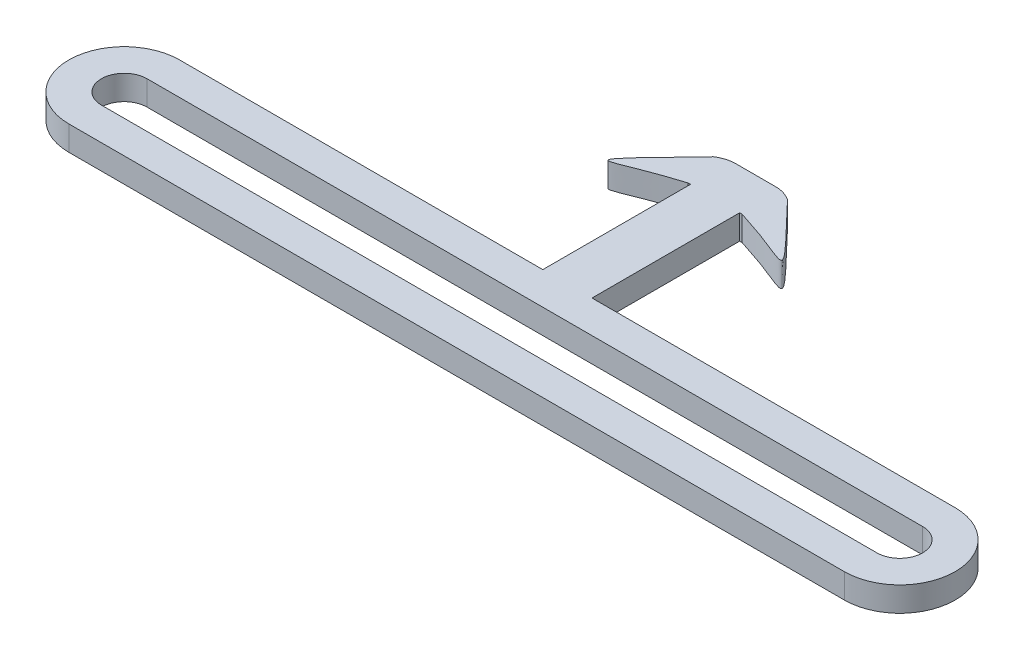
ISO-10303-21;
HEADER;
FILE_DESCRIPTION(('STEP AP214'),'2;1');
FILE_NAME('part.step','',(''),(''),'','','');
FILE_SCHEMA(('AUTOMOTIVE_DESIGN { 1 0 10303 214 1 1 1 1 }'));
ENDSEC;
DATA;
#1=APPLICATION_CONTEXT('core data for automotive mechanical design processes');
#2=APPLICATION_PROTOCOL_DEFINITION('international standard','automotive_design',2000,#1);
#3=PRODUCT_CONTEXT('',#1,'mechanical');
#4=PRODUCT('Part','Part','',(#3));
#5=PRODUCT_RELATED_PRODUCT_CATEGORY('part','',(#4));
#6=PRODUCT_DEFINITION_FORMATION('','',#4);
#7=PRODUCT_DEFINITION_CONTEXT('part definition',#1,'design');
#8=PRODUCT_DEFINITION('design','',#6,#7);
#9=PRODUCT_DEFINITION_SHAPE('','',#8);
#10=(LENGTH_UNIT() NAMED_UNIT(*) SI_UNIT(.MILLI.,.METRE.));
#11=(NAMED_UNIT(*) PLANE_ANGLE_UNIT() SI_UNIT($,.RADIAN.));
#12=(NAMED_UNIT(*) SI_UNIT($,.STERADIAN.) SOLID_ANGLE_UNIT());
#13=UNCERTAINTY_MEASURE_WITH_UNIT(LENGTH_MEASURE(1.E-05),#10,'distance_accuracy_value','');
#14=(GEOMETRIC_REPRESENTATION_CONTEXT(3) GLOBAL_UNCERTAINTY_ASSIGNED_CONTEXT((#13)) GLOBAL_UNIT_ASSIGNED_CONTEXT((#10,
#11,#12)) REPRESENTATION_CONTEXT('',''));
#15=CARTESIAN_POINT('',(0.,0.,0.));
#16=DIRECTION('',(0.,0.,1.));
#17=DIRECTION('',(1.,0.,0.));
#18=AXIS2_PLACEMENT_3D('',#15,#16,#17);
#19=CARTESIAN_POINT('',(-40.0341902731434,1.27,-0.0149194848737301));
#20=DIRECTION('',(0.,1.,0.));
#21=DIRECTION('',(0.,0.,1.));
#22=AXIS2_PLACEMENT_3D('',#19,#20,#21);
#23=PLANE('',#22);
#24=CARTESIAN_POINT('',(-40.0341902731434,1.27,-0.0149194848737301));
#25=DIRECTION('',(0.,1.,0.));
#26=DIRECTION('',(0.,0.,1.));
#27=AXIS2_PLACEMENT_3D('',#24,#25,#26);
#28=CIRCLE('',#27,5.71847295364556);
#29=CARTESIAN_POINT('',(-40.0341745110672,1.27,-5.73339243849756));
#30=VERTEX_POINT('',#29);
#31=CARTESIAN_POINT('',(-40.0341745110672,1.27,5.7035534687501));
#32=VERTEX_POINT('',#31);
#33=EDGE_CURVE('E205',#30,#32,#28,.T.);
#34=ORIENTED_EDGE('',*,*,#33,.T.);
#35=DIRECTION('',(1.,0.,0.));
#36=VECTOR('',#35,1.);
#37=CARTESIAN_POINT('',(-40.0341745110672,1.27,5.7035534687501));
#38=LINE('',#37,#36);
#39=CARTESIAN_POINT('',(40.0236836922629,1.27,5.7035534687501));
#40=VERTEX_POINT('',#39);
#41=EDGE_CURVE('E202',#32,#40,#38,.T.);
#42=ORIENTED_EDGE('',*,*,#41,.T.);
#43=CARTESIAN_POINT('',(40.023699454339,1.27,-0.0149194848737301));
#44=DIRECTION('',(0.,1.,0.));
#45=DIRECTION('',(0.,0.,1.));
#46=AXIS2_PLACEMENT_3D('',#43,#44,#45);
#47=CIRCLE('',#46,5.71847295364556);
#48=CARTESIAN_POINT('',(40.0236836922629,1.27,-5.73339243849756));
#49=VERTEX_POINT('',#48);
#50=EDGE_CURVE('E208',#40,#49,#47,.T.);
#51=ORIENTED_EDGE('',*,*,#50,.T.);
#52=DIRECTION('',(-1.,0.,0.));
#53=VECTOR('',#52,1.);
#54=CARTESIAN_POINT('',(2.53475459059783,1.27,-5.73339243849756));
#55=LINE('',#54,#53);
#56=CARTESIAN_POINT('',(2.53475459059783,1.27,-5.73339243849756));
#57=VERTEX_POINT('',#56);
#58=EDGE_CURVE('E209',#49,#57,#55,.T.);
#59=ORIENTED_EDGE('',*,*,#58,.T.);
#60=DIRECTION('',(0.,0.,-1.));
#61=VECTOR('',#60,1.);
#62=CARTESIAN_POINT('',(2.53475459059783,1.27,-5.73339243849756));
#63=LINE('',#62,#61);
#64=CARTESIAN_POINT('',(2.53475459059783,1.27,-20.9796872274859));
#65=VERTEX_POINT('',#64);
#66=EDGE_CURVE('E215',#57,#65,#63,.T.);
#67=ORIENTED_EDGE('',*,*,#66,.T.);
#68=DIRECTION('',(1.,0.,0.));
#69=VECTOR('',#68,1.);
#70=CARTESIAN_POINT('',(2.53475459059783,1.27,-20.9796872274859));
#71=LINE('',#70,#69);
#72=CARTESIAN_POINT('',(2.78162607733212,1.27,-20.9796872274859));
#73=VERTEX_POINT('',#72);
#74=EDGE_CURVE('E212',#65,#73,#71,.T.);
#75=ORIENTED_EDGE('',*,*,#74,.T.);
#76=CARTESIAN_POINT('',(2.78162607733212,1.27,-20.9796872274859));
#77=CARTESIAN_POINT('',(3.52042885987217,1.27,-20.7454387312885));
#78=CARTESIAN_POINT('',(9.64139567893254,1.27,-18.7539301977186));
#79=CARTESIAN_POINT('',(11.0773756931817,1.27,-17.0362187075331));
#80=CARTESIAN_POINT('',(3.81513243898493,1.27,-24.6322950873317));
#81=B_SPLINE_CURVE_WITH_KNOTS('',3,(#76,#77,#78,#79,#80),.UNSPECIFIED.,.F.,.F.,(4,1,4),(0.,
0.0920840873115873,0.688115303605151),.UNSPECIFIED.);
#82=CARTESIAN_POINT('',(3.81513243898493,1.27,-24.6322950873317));
#83=VERTEX_POINT('',#82);
#84=EDGE_CURVE('E216',#73,#83,#81,.T.);
#85=ORIENTED_EDGE('',*,*,#84,.T.);
#86=CARTESIAN_POINT('',(2.04302221044935,1.27,-21.9448379265403));
#87=DIRECTION('',(0.,1.,0.));
#88=DIRECTION('',(0.,0.,-1.));
#89=AXIS2_PLACEMENT_3D('',#86,#87,#88);
#90=CIRCLE('',#89,3.21913041878852);
#91=CARTESIAN_POINT('',(2.04302221044935,1.27,-25.1639683453288));
#92=VERTEX_POINT('',#91);
#93=EDGE_CURVE('E222',#83,#92,#90,.T.);
#94=ORIENTED_EDGE('',*,*,#93,.T.);
#95=DIRECTION('',(-1.,0.,0.));
#96=VECTOR('',#95,1.);
#97=CARTESIAN_POINT('',(-2.05351302925369,1.27,-25.1639683453288));
#98=LINE('',#97,#96);
#99=CARTESIAN_POINT('',(-2.05351302925369,1.27,-25.1639683453288));
#100=VERTEX_POINT('',#99);
#101=EDGE_CURVE('E414',#92,#100,#98,.T.);
#102=ORIENTED_EDGE('',*,*,#101,.T.);
#103=CARTESIAN_POINT('',(-2.05351302925369,1.27,-21.9448379265403));
#104=DIRECTION('',(0.,1.,0.));
#105=DIRECTION('',(0.,0.,1.));
#106=AXIS2_PLACEMENT_3D('',#103,#104,#105);
#107=CIRCLE('',#106,3.21913041878852);
#108=CARTESIAN_POINT('',(-3.82562325778927,1.27,-24.6322950873317));
#109=VERTEX_POINT('',#108);
#110=EDGE_CURVE('E291',#100,#109,#107,.T.);
#111=ORIENTED_EDGE('',*,*,#110,.T.);
#112=CARTESIAN_POINT('',(-3.82562325778927,1.27,-24.6322950873317));
#113=CARTESIAN_POINT('',(-11.1749253657315,1.27,-17.014448000265));
#114=CARTESIAN_POINT('',(-9.5602391181665,1.27,-18.7816400789337));
#115=CARTESIAN_POINT('',(-3.53525924793453,1.27,-20.7452071795836));
#116=CARTESIAN_POINT('',(-2.79211689613646,1.27,-20.9796872274859));
#117=B_SPLINE_CURVE_WITH_KNOTS('',3,(#112,#113,#114,#115,#116),.UNSPECIFIED.,.F.,.F.,(4,1,4),
(0.,0.594260847383624,0.687271601673899),.UNSPECIFIED.);
#118=CARTESIAN_POINT('',(-2.79211689613646,1.27,-20.9796872274859));
#119=VERTEX_POINT('',#118);
#120=EDGE_CURVE('E287',#109,#119,#117,.T.);
#121=ORIENTED_EDGE('',*,*,#120,.T.);
#122=DIRECTION('',(1.,0.,0.));
#123=VECTOR('',#122,1.);
#124=CARTESIAN_POINT('',(-2.79211689613646,1.27,-20.9796872274859));
#125=LINE('',#124,#123);
#126=CARTESIAN_POINT('',(-2.54524540940217,1.27,-20.9796872274859));
#127=VERTEX_POINT('',#126);
#128=EDGE_CURVE('E295',#119,#127,#125,.T.);
#129=ORIENTED_EDGE('',*,*,#128,.T.);
#130=DIRECTION('',(0.,0.,1.));
#131=VECTOR('',#130,1.);
#132=CARTESIAN_POINT('',(-2.54524540940217,1.27,-5.73339243849756));
#133=LINE('',#132,#131);
#134=CARTESIAN_POINT('',(-2.54524540940217,1.27,-5.73339243849756));
#135=VERTEX_POINT('',#134);
#136=EDGE_CURVE('E297',#127,#135,#133,.T.);
#137=ORIENTED_EDGE('',*,*,#136,.T.);
#138=DIRECTION('',(-1.,0.,0.));
#139=VECTOR('',#138,1.);
#140=CARTESIAN_POINT('',(-40.0341745110672,1.27,-5.73339243849756));
#141=LINE('',#140,#139);
#142=EDGE_CURVE('E296',#135,#30,#141,.T.);
#143=ORIENTED_EDGE('',*,*,#142,.T.);
#144=EDGE_LOOP('',(#34,#42,#51,#59,#67,#75,#85,#94,#102,#111,#121,#129,#137,#143));
#145=FACE_BOUND('',#144,.T.);
#146=DIRECTION('',(1.,0.,0.));
#147=VECTOR('',#146,1.);
#148=CARTESIAN_POINT('',(-40.0341902731434,1.27,2.34273040802263));
#149=LINE('',#148,#147);
#150=CARTESIAN_POINT('',(-40.0341902731434,1.27,2.34273040802263));
#151=VERTEX_POINT('',#150);
#152=CARTESIAN_POINT('',(40.023699454339,1.27,2.34273040802263));
#153=VERTEX_POINT('',#152);
#154=EDGE_CURVE('E175',#151,#153,#149,.T.);
#155=ORIENTED_EDGE('',*,*,#154,.F.);
#156=CARTESIAN_POINT('',(-40.0341902731434,1.27,-0.0149194848737301));
#157=DIRECTION('',(0.,1.,0.));
#158=DIRECTION('',(0.,0.,1.));
#159=AXIS2_PLACEMENT_3D('',#156,#157,#158);
#160=CIRCLE('',#159,2.35764989289636);
#161=CARTESIAN_POINT('',(-40.0341902731434,1.27,-2.37256937777009));
#162=VERTEX_POINT('',#161);
#163=EDGE_CURVE('E167',#162,#151,#160,.T.);
#164=ORIENTED_EDGE('',*,*,#163,.F.);
#165=DIRECTION('',(-1.,0.,0.));
#166=VECTOR('',#165,1.);
#167=CARTESIAN_POINT('',(-40.0341902731434,1.27,-2.37256937777009));
#168=LINE('',#167,#166);
#169=CARTESIAN_POINT('',(40.023699454339,1.27,-2.37256937777009));
#170=VERTEX_POINT('',#169);
#171=EDGE_CURVE('E187',#170,#162,#168,.T.);
#172=ORIENTED_EDGE('',*,*,#171,.F.);
#173=CARTESIAN_POINT('',(40.023699454339,1.27,-0.0149194848737301));
#174=DIRECTION('',(0.,1.,0.));
#175=DIRECTION('',(0.,0.,1.));
#176=AXIS2_PLACEMENT_3D('',#173,#174,#175);
#177=CIRCLE('',#176,2.35764989289636);
#178=EDGE_CURVE('E188',#153,#170,#177,.T.);
#179=ORIENTED_EDGE('',*,*,#178,.F.);
#180=EDGE_LOOP('',(#155,#164,#172,#179));
#181=FACE_BOUND('',#180,.T.);
#182=ADVANCED_FACE('F41',(#145,#181),#23,.T.);
#183=CARTESIAN_POINT('',(-40.0341902731434,-1.27,-0.0149194848737301));
#184=DIRECTION('',(0.,1.,0.));
#185=DIRECTION('',(0.,0.,1.));
#186=AXIS2_PLACEMENT_3D('',#183,#184,#185);
#187=PLANE('',#186);
#188=CARTESIAN_POINT('',(-40.0341902731434,-1.27,-0.0149194848737301));
#189=DIRECTION('',(0.,1.,0.));
#190=DIRECTION('',(0.,0.,1.));
#191=AXIS2_PLACEMENT_3D('',#188,#189,#190);
#192=CIRCLE('',#191,5.71847295364556);
#193=CARTESIAN_POINT('',(-40.0341745110672,-1.27,-5.73339243849756));
#194=VERTEX_POINT('',#193);
#195=CARTESIAN_POINT('',(-40.0341745110672,-1.27,5.7035534687501));
#196=VERTEX_POINT('',#195);
#197=EDGE_CURVE('E185',#194,#196,#192,.T.);
#198=ORIENTED_EDGE('',*,*,#197,.F.);
#199=DIRECTION('',(-1.,0.,0.));
#200=VECTOR('',#199,1.);
#201=CARTESIAN_POINT('',(-40.0341745110672,-1.27,-5.73339243849756));
#202=LINE('',#201,#200);
#203=CARTESIAN_POINT('',(-2.54524540940217,-1.27,-5.73339243849756));
#204=VERTEX_POINT('',#203);
#205=EDGE_CURVE('E206',#204,#194,#202,.T.);
#206=ORIENTED_EDGE('',*,*,#205,.F.);
#207=DIRECTION('',(0.,0.,1.));
#208=VECTOR('',#207,1.);
#209=CARTESIAN_POINT('',(-2.54524540940217,-1.27,-5.73339243849756));
#210=LINE('',#209,#208);
#211=CARTESIAN_POINT('',(-2.54524540940217,-1.27,-20.9796872274859));
#212=VERTEX_POINT('',#211);
#213=EDGE_CURVE('E339',#212,#204,#210,.T.);
#214=ORIENTED_EDGE('',*,*,#213,.F.);
#215=DIRECTION('',(1.,0.,0.));
#216=VECTOR('',#215,1.);
#217=CARTESIAN_POINT('',(-2.79211689613646,-1.27,-20.9796872274859));
#218=LINE('',#217,#216);
#219=CARTESIAN_POINT('',(-2.79211689613646,-1.27,-20.9796872274859));
#220=VERTEX_POINT('',#219);
#221=EDGE_CURVE('E335',#220,#212,#218,.T.);
#222=ORIENTED_EDGE('',*,*,#221,.F.);
#223=CARTESIAN_POINT('',(-3.82562325778927,-1.27,-24.6322950873317));
#224=CARTESIAN_POINT('',(-11.1749253657315,-1.27,-17.014448000265));
#225=CARTESIAN_POINT('',(-9.5602391181665,-1.27,-18.7816400789337));
#226=CARTESIAN_POINT('',(-3.53525924793453,-1.27,-20.7452071795836));
#227=CARTESIAN_POINT('',(-2.79211689613646,-1.27,-20.9796872274859));
#228=B_SPLINE_CURVE_WITH_KNOTS('',3,(#223,#224,#225,#226,#227),.UNSPECIFIED.,.F.,.F.,(4,1,4),
(0.,0.594260847383624,0.687271601673899),.UNSPECIFIED.);
#229=CARTESIAN_POINT('',(-3.82562325778927,-1.27,-24.6322950873317));
#230=VERTEX_POINT('',#229);
#231=EDGE_CURVE('E327',#230,#220,#228,.T.);
#232=ORIENTED_EDGE('',*,*,#231,.F.);
#233=CARTESIAN_POINT('',(-2.05351302925369,-1.27,-21.9448379265403));
#234=DIRECTION('',(0.,1.,0.));
#235=DIRECTION('',(0.,0.,1.));
#236=AXIS2_PLACEMENT_3D('',#233,#234,#235);
#237=CIRCLE('',#236,3.21913041878852);
#238=CARTESIAN_POINT('',(-2.05351302925369,-1.27,-25.1639683453288));
#239=VERTEX_POINT('',#238);
#240=EDGE_CURVE('E326',#239,#230,#237,.T.);
#241=ORIENTED_EDGE('',*,*,#240,.F.);
#242=DIRECTION('',(-1.,0.,0.));
#243=VECTOR('',#242,1.);
#244=CARTESIAN_POINT('',(-2.05351302925369,-1.27,-25.1639683453288));
#245=LINE('',#244,#243);
#246=CARTESIAN_POINT('',(2.04302221044935,-1.27,-25.1639683453288));
#247=VERTEX_POINT('',#246);
#248=EDGE_CURVE('E322',#247,#239,#245,.T.);
#249=ORIENTED_EDGE('',*,*,#248,.F.);
#250=CARTESIAN_POINT('',(2.04302221044935,-1.27,-21.9448379265403));
#251=DIRECTION('',(0.,1.,0.));
#252=DIRECTION('',(0.,0.,-1.));
#253=AXIS2_PLACEMENT_3D('',#250,#251,#252);
#254=CIRCLE('',#253,3.21913041878852);
#255=CARTESIAN_POINT('',(3.81513243898493,-1.27,-24.6322950873317));
#256=VERTEX_POINT('',#255);
#257=EDGE_CURVE('E317',#256,#247,#254,.T.);
#258=ORIENTED_EDGE('',*,*,#257,.F.);
#259=CARTESIAN_POINT('',(2.78162607733212,-1.27,-20.9796872274859));
#260=CARTESIAN_POINT('',(3.52042885987217,-1.27,-20.7454387312885));
#261=CARTESIAN_POINT('',(9.64139567893254,-1.27,-18.7539301977186));
#262=CARTESIAN_POINT('',(11.0773756931817,-1.27,-17.0362187075331));
#263=CARTESIAN_POINT('',(3.81513243898493,-1.27,-24.6322950873317));
#264=B_SPLINE_CURVE_WITH_KNOTS('',3,(#259,#260,#261,#262,#263),.UNSPECIFIED.,.F.,.F.,(4,1,4),
(0.,0.0920840873115873,0.688115303605151),.UNSPECIFIED.);
#265=CARTESIAN_POINT('',(2.78162607733212,-1.27,-20.9796872274859));
#266=VERTEX_POINT('',#265);
#267=EDGE_CURVE('E312',#266,#256,#264,.T.);
#268=ORIENTED_EDGE('',*,*,#267,.F.);
#269=DIRECTION('',(1.,0.,0.));
#270=VECTOR('',#269,1.);
#271=CARTESIAN_POINT('',(2.53475459059783,-1.27,-20.9796872274859));
#272=LINE('',#271,#270);
#273=CARTESIAN_POINT('',(2.53475459059783,-1.27,-20.9796872274859));
#274=VERTEX_POINT('',#273);
#275=EDGE_CURVE('E311',#274,#266,#272,.T.);
#276=ORIENTED_EDGE('',*,*,#275,.F.);
#277=DIRECTION('',(0.,0.,-1.));
#278=VECTOR('',#277,1.);
#279=CARTESIAN_POINT('',(2.53475459059783,-1.27,-5.73339243849756));
#280=LINE('',#279,#278);
#281=CARTESIAN_POINT('',(2.53475459059783,-1.27,-5.73339243849756));
#282=VERTEX_POINT('',#281);
#283=EDGE_CURVE('E313',#282,#274,#280,.T.);
#284=ORIENTED_EDGE('',*,*,#283,.F.);
#285=DIRECTION('',(-1.,0.,0.));
#286=VECTOR('',#285,1.);
#287=CARTESIAN_POINT('',(2.53475459059783,-1.27,-5.73339243849756));
#288=LINE('',#287,#286);
#289=CARTESIAN_POINT('',(40.0236836922629,-1.27,-5.73339243849756));
#290=VERTEX_POINT('',#289);
#291=EDGE_CURVE('E310',#290,#282,#288,.T.);
#292=ORIENTED_EDGE('',*,*,#291,.F.);
#293=CARTESIAN_POINT('',(40.023699454339,-1.27,-0.0149194848737301));
#294=DIRECTION('',(0.,1.,0.));
#295=DIRECTION('',(0.,0.,1.));
#296=AXIS2_PLACEMENT_3D('',#293,#294,#295);
#297=CIRCLE('',#296,5.71847295364556);
#298=CARTESIAN_POINT('',(40.0236836922629,-1.27,5.7035534687501));
#299=VERTEX_POINT('',#298);
#300=EDGE_CURVE('E307',#299,#290,#297,.T.);
#301=ORIENTED_EDGE('',*,*,#300,.F.);
#302=DIRECTION('',(1.,0.,0.));
#303=VECTOR('',#302,1.);
#304=CARTESIAN_POINT('',(-40.0341745110672,-1.27,5.7035534687501));
#305=LINE('',#304,#303);
#306=EDGE_CURVE('E303',#196,#299,#305,.T.);
#307=ORIENTED_EDGE('',*,*,#306,.F.);
#308=EDGE_LOOP('',(#198,#206,#214,#222,#232,#241,#249,#258,#268,#276,#284,#292,#301,#307));
#309=FACE_BOUND('',#308,.T.);
#310=CARTESIAN_POINT('',(-40.0341902731434,-1.27,-0.0149194848737301));
#311=DIRECTION('',(0.,1.,0.));
#312=DIRECTION('',(0.,0.,1.));
#313=AXIS2_PLACEMENT_3D('',#310,#311,#312);
#314=CIRCLE('',#313,2.35764989289636);
#315=CARTESIAN_POINT('',(-40.0341902731434,-1.27,-2.37256937777009));
#316=VERTEX_POINT('',#315);
#317=CARTESIAN_POINT('',(-40.0341902731434,-1.27,2.34273040802263));
#318=VERTEX_POINT('',#317);
#319=EDGE_CURVE('E65',#316,#318,#314,.T.);
#320=ORIENTED_EDGE('',*,*,#319,.T.);
#321=DIRECTION('',(1.,0.,0.));
#322=VECTOR('',#321,1.);
#323=CARTESIAN_POINT('',(-40.0341902731434,-1.27,2.34273040802263));
#324=LINE('',#323,#322);
#325=CARTESIAN_POINT('',(40.023699454339,-1.27,2.34273040802263));
#326=VERTEX_POINT('',#325);
#327=EDGE_CURVE('E182',#318,#326,#324,.T.);
#328=ORIENTED_EDGE('',*,*,#327,.T.);
#329=CARTESIAN_POINT('',(40.023699454339,-1.27,-0.0149194848737301));
#330=DIRECTION('',(0.,1.,0.));
#331=DIRECTION('',(0.,0.,1.));
#332=AXIS2_PLACEMENT_3D('',#329,#330,#331);
#333=CIRCLE('',#332,2.35764989289636);
#334=CARTESIAN_POINT('',(40.023699454339,-1.27,-2.37256937777009));
#335=VERTEX_POINT('',#334);
#336=EDGE_CURVE('E191',#326,#335,#333,.T.);
#337=ORIENTED_EDGE('',*,*,#336,.T.);
#338=DIRECTION('',(-1.,0.,0.));
#339=VECTOR('',#338,1.);
#340=CARTESIAN_POINT('',(-40.0341902731434,-1.27,-2.37256937777009));
#341=LINE('',#340,#339);
#342=EDGE_CURVE('E171',#335,#316,#341,.T.);
#343=ORIENTED_EDGE('',*,*,#342,.T.);
#344=EDGE_LOOP('',(#320,#328,#337,#343));
#345=FACE_BOUND('',#344,.T.);
#346=ADVANCED_FACE('F254',(#309,#345),#187,.F.);
#347=CARTESIAN_POINT('',(-40.0341902731434,1.27,-0.0149194848737301));
#348=DIRECTION('',(0.,-1.,0.));
#349=DIRECTION('',(0.,0.,-1.));
#350=AXIS2_PLACEMENT_3D('',#347,#348,#349);
#351=CYLINDRICAL_SURFACE('',#350,5.71847295364556);
#352=ORIENTED_EDGE('',*,*,#197,.T.);
#353=DIRECTION('',(0.,-1.,0.));
#354=VECTOR('',#353,1.);
#355=CARTESIAN_POINT('',(-40.0341745110672,1.27,5.7035534687501));
#356=LINE('',#355,#354);
#357=EDGE_CURVE('E11',#32,#196,#356,.T.);
#358=ORIENTED_EDGE('',*,*,#357,.F.);
#359=ORIENTED_EDGE('',*,*,#33,.F.);
#360=DIRECTION('',(0.,-1.,0.));
#361=VECTOR('',#360,1.);
#362=CARTESIAN_POINT('',(-40.0341745110672,1.27,-5.73339243849756));
#363=LINE('',#362,#361);
#364=EDGE_CURVE('E305',#30,#194,#363,.T.);
#365=ORIENTED_EDGE('',*,*,#364,.T.);
#366=EDGE_LOOP('',(#352,#358,#359,#365));
#367=FACE_BOUND('',#366,.T.);
#368=ADVANCED_FACE('F43',(#367),#351,.T.);
#369=CARTESIAN_POINT('',(-40.0341745110672,1.27,5.7035534687501));
#370=DIRECTION('',(0.,0.,-1.));
#371=DIRECTION('',(-1.,0.,0.));
#372=AXIS2_PLACEMENT_3D('',#369,#370,#371);
#373=PLANE('',#372);
#374=ORIENTED_EDGE('',*,*,#306,.T.);
#375=DIRECTION('',(0.,-1.,0.));
#376=VECTOR('',#375,1.);
#377=CARTESIAN_POINT('',(40.0236836922629,1.27,5.7035534687501));
#378=LINE('',#377,#376);
#379=EDGE_CURVE('E47',#40,#299,#378,.T.);
#380=ORIENTED_EDGE('',*,*,#379,.F.);
#381=ORIENTED_EDGE('',*,*,#41,.F.);
#382=ORIENTED_EDGE('',*,*,#357,.T.);
#383=EDGE_LOOP('',(#374,#380,#381,#382));
#384=FACE_BOUND('',#383,.T.);
#385=ADVANCED_FACE('F249',(#384),#373,.F.);
#386=CARTESIAN_POINT('',(40.023699454339,1.27,-0.0149194848737301));
#387=DIRECTION('',(0.,-1.,0.));
#388=DIRECTION('',(0.,0.,-1.));
#389=AXIS2_PLACEMENT_3D('',#386,#387,#388);
#390=CYLINDRICAL_SURFACE('',#389,5.71847295364556);
#391=ORIENTED_EDGE('',*,*,#300,.T.);
#392=DIRECTION('',(0.,-1.,0.));
#393=VECTOR('',#392,1.);
#394=CARTESIAN_POINT('',(40.0236836922629,1.27,-5.73339243849756));
#395=LINE('',#394,#393);
#396=EDGE_CURVE('E375',#49,#290,#395,.T.);
#397=ORIENTED_EDGE('',*,*,#396,.F.);
#398=ORIENTED_EDGE('',*,*,#50,.F.);
#399=ORIENTED_EDGE('',*,*,#379,.T.);
#400=EDGE_LOOP('',(#391,#397,#398,#399));
#401=FACE_BOUND('',#400,.T.);
#402=ADVANCED_FACE('F241',(#401),#390,.T.);
#403=CARTESIAN_POINT('',(2.53475459059783,1.27,-5.73339243849756));
#404=DIRECTION('',(0.,0.,1.));
#405=DIRECTION('',(1.,0.,0.));
#406=AXIS2_PLACEMENT_3D('',#403,#404,#405);
#407=PLANE('',#406);
#408=ORIENTED_EDGE('',*,*,#291,.T.);
#409=DIRECTION('',(0.,-1.,0.));
#410=VECTOR('',#409,1.);
#411=CARTESIAN_POINT('',(2.53475459059783,1.27,-5.73339243849756));
#412=LINE('',#411,#410);
#413=EDGE_CURVE('E369',#57,#282,#412,.T.);
#414=ORIENTED_EDGE('',*,*,#413,.F.);
#415=ORIENTED_EDGE('',*,*,#58,.F.);
#416=ORIENTED_EDGE('',*,*,#396,.T.);
#417=EDGE_LOOP('',(#408,#414,#415,#416));
#418=FACE_BOUND('',#417,.T.);
#419=ADVANCED_FACE('F243',(#418),#407,.F.);
#420=CARTESIAN_POINT('',(2.53475459059783,1.27,-5.73339243849756));
#421=DIRECTION('',(-1.,0.,0.));
#422=DIRECTION('',(0.,0.,1.));
#423=AXIS2_PLACEMENT_3D('',#420,#421,#422);
#424=PLANE('',#423);
#425=ORIENTED_EDGE('',*,*,#283,.T.);
#426=DIRECTION('',(0.,-1.,0.));
#427=VECTOR('',#426,1.);
#428=CARTESIAN_POINT('',(2.53475459059783,1.27,-20.9796872274859));
#429=LINE('',#428,#427);
#430=EDGE_CURVE('E368',#65,#274,#429,.T.);
#431=ORIENTED_EDGE('',*,*,#430,.F.);
#432=ORIENTED_EDGE('',*,*,#66,.F.);
#433=ORIENTED_EDGE('',*,*,#413,.T.);
#434=EDGE_LOOP('',(#425,#431,#432,#433));
#435=FACE_BOUND('',#434,.T.);
#436=ADVANCED_FACE('F240',(#435),#424,.F.);
#437=CARTESIAN_POINT('',(2.53475459059783,1.27,-20.9796872274859));
#438=DIRECTION('',(0.,0.,-1.));
#439=DIRECTION('',(-1.,0.,0.));
#440=AXIS2_PLACEMENT_3D('',#437,#438,#439);
#441=PLANE('',#440);
#442=ORIENTED_EDGE('',*,*,#275,.T.);
#443=DIRECTION('',(0.,-1.,0.));
#444=VECTOR('',#443,1.);
#445=CARTESIAN_POINT('',(2.78162607733212,1.27,-20.9796872274859));
#446=LINE('',#445,#444);
#447=EDGE_CURVE('E361',#73,#266,#446,.T.);
#448=ORIENTED_EDGE('',*,*,#447,.F.);
#449=ORIENTED_EDGE('',*,*,#74,.F.);
#450=ORIENTED_EDGE('',*,*,#430,.T.);
#451=EDGE_LOOP('',(#442,#448,#449,#450));
#452=FACE_BOUND('',#451,.T.);
#453=ADVANCED_FACE('F235',(#452),#441,.F.);
#454=DIRECTION('',(0.,-1.,0.));
#455=VECTOR('',#454,1.);
#456=SURFACE_OF_LINEAR_EXTRUSION('',#81,#455);
#457=ORIENTED_EDGE('',*,*,#267,.T.);
#458=DIRECTION('',(0.,-1.,0.));
#459=VECTOR('',#458,1.);
#460=CARTESIAN_POINT('',(3.81513243898493,1.27,-24.6322950873317));
#461=LINE('',#460,#459);
#462=EDGE_CURVE('E358',#83,#256,#461,.T.);
#463=ORIENTED_EDGE('',*,*,#462,.F.);
#464=ORIENTED_EDGE('',*,*,#84,.F.);
#465=ORIENTED_EDGE('',*,*,#447,.T.);
#466=EDGE_LOOP('',(#457,#463,#464,#465));
#467=FACE_BOUND('',#466,.T.);
#468=ADVANCED_FACE('F229',(#467),#456,.F.);
#469=CARTESIAN_POINT('',(2.04302221044935,1.27,-21.9448379265403));
#470=DIRECTION('',(0.,-1.,0.));
#471=DIRECTION('',(0.,0.,-1.));
#472=AXIS2_PLACEMENT_3D('',#469,#470,#471);
#473=CYLINDRICAL_SURFACE('',#472,3.21913041878852);
#474=ORIENTED_EDGE('',*,*,#257,.T.);
#475=DIRECTION('',(0.,-1.,0.));
#476=VECTOR('',#475,1.);
#477=CARTESIAN_POINT('',(2.04302221044935,1.27,-25.1639683453288));
#478=LINE('',#477,#476);
#479=EDGE_CURVE('E360',#92,#247,#478,.T.);
#480=ORIENTED_EDGE('',*,*,#479,.F.);
#481=ORIENTED_EDGE('',*,*,#93,.F.);
#482=ORIENTED_EDGE('',*,*,#462,.T.);
#483=EDGE_LOOP('',(#474,#480,#481,#482));
#484=FACE_BOUND('',#483,.T.);
#485=ADVANCED_FACE('F232',(#484),#473,.T.);
#486=CARTESIAN_POINT('',(-2.05351302925369,1.27,-25.1639683453288));
#487=DIRECTION('',(0.,0.,1.));
#488=DIRECTION('',(1.,0.,0.));
#489=AXIS2_PLACEMENT_3D('',#486,#487,#488);
#490=PLANE('',#489);
#491=ORIENTED_EDGE('',*,*,#248,.T.);
#492=DIRECTION('',(0.,-1.,0.));
#493=VECTOR('',#492,1.);
#494=CARTESIAN_POINT('',(-2.05351302925369,1.27,-25.1639683453288));
#495=LINE('',#494,#493);
#496=EDGE_CURVE('E355',#100,#239,#495,.T.);
#497=ORIENTED_EDGE('',*,*,#496,.F.);
#498=ORIENTED_EDGE('',*,*,#101,.F.);
#499=ORIENTED_EDGE('',*,*,#479,.T.);
#500=EDGE_LOOP('',(#491,#497,#498,#499));
#501=FACE_BOUND('',#500,.T.);
#502=ADVANCED_FACE('F415',(#501),#490,.F.);
#503=CARTESIAN_POINT('',(-2.05351302925369,1.27,-21.9448379265403));
#504=DIRECTION('',(0.,-1.,0.));
#505=DIRECTION('',(0.,0.,-1.));
#506=AXIS2_PLACEMENT_3D('',#503,#504,#505);
#507=CYLINDRICAL_SURFACE('',#506,3.21913041878852);
#508=ORIENTED_EDGE('',*,*,#240,.T.);
#509=DIRECTION('',(0.,-1.,0.));
#510=VECTOR('',#509,1.);
#511=CARTESIAN_POINT('',(-3.82562325778927,1.27,-24.6322950873317));
#512=LINE('',#511,#510);
#513=EDGE_CURVE('E353',#109,#230,#512,.T.);
#514=ORIENTED_EDGE('',*,*,#513,.F.);
#515=ORIENTED_EDGE('',*,*,#110,.F.);
#516=ORIENTED_EDGE('',*,*,#496,.T.);
#517=EDGE_LOOP('',(#508,#514,#515,#516));
#518=FACE_BOUND('',#517,.T.);
#519=ADVANCED_FACE('F285',(#518),#507,.T.);
#520=DIRECTION('',(0.,-1.,0.));
#521=VECTOR('',#520,1.);
#522=SURFACE_OF_LINEAR_EXTRUSION('',#117,#521);
#523=ORIENTED_EDGE('',*,*,#231,.T.);
#524=DIRECTION('',(0.,-1.,0.));
#525=VECTOR('',#524,1.);
#526=CARTESIAN_POINT('',(-2.79211689613646,1.27,-20.9796872274859));
#527=LINE('',#526,#525);
#528=EDGE_CURVE('E346',#119,#220,#527,.T.);
#529=ORIENTED_EDGE('',*,*,#528,.F.);
#530=ORIENTED_EDGE('',*,*,#120,.F.);
#531=ORIENTED_EDGE('',*,*,#513,.T.);
#532=EDGE_LOOP('',(#523,#529,#530,#531));
#533=FACE_BOUND('',#532,.T.);
#534=ADVANCED_FACE('F276',(#533),#522,.F.);
#535=CARTESIAN_POINT('',(-2.79211689613646,1.27,-20.9796872274859));
#536=DIRECTION('',(0.,0.,-1.));
#537=DIRECTION('',(-1.,0.,0.));
#538=AXIS2_PLACEMENT_3D('',#535,#536,#537);
#539=PLANE('',#538);
#540=ORIENTED_EDGE('',*,*,#221,.T.);
#541=DIRECTION('',(0.,-1.,0.));
#542=VECTOR('',#541,1.);
#543=CARTESIAN_POINT('',(-2.54524540940217,1.27,-20.9796872274859));
#544=LINE('',#543,#542);
#545=EDGE_CURVE('E343',#127,#212,#544,.T.);
#546=ORIENTED_EDGE('',*,*,#545,.F.);
#547=ORIENTED_EDGE('',*,*,#128,.F.);
#548=ORIENTED_EDGE('',*,*,#528,.T.);
#549=EDGE_LOOP('',(#540,#546,#547,#548));
#550=FACE_BOUND('',#549,.T.);
#551=ADVANCED_FACE('F274',(#550),#539,.F.);
#552=CARTESIAN_POINT('',(-2.54524540940217,1.27,-5.73339243849756));
#553=DIRECTION('',(1.,0.,0.));
#554=DIRECTION('',(0.,0.,-1.));
#555=AXIS2_PLACEMENT_3D('',#552,#553,#554);
#556=PLANE('',#555);
#557=ORIENTED_EDGE('',*,*,#213,.T.);
#558=DIRECTION('',(0.,-1.,0.));
#559=VECTOR('',#558,1.);
#560=CARTESIAN_POINT('',(-2.54524540940217,1.27,-5.73339243849756));
#561=LINE('',#560,#559);
#562=EDGE_CURVE('E345',#135,#204,#561,.T.);
#563=ORIENTED_EDGE('',*,*,#562,.F.);
#564=ORIENTED_EDGE('',*,*,#136,.F.);
#565=ORIENTED_EDGE('',*,*,#545,.T.);
#566=EDGE_LOOP('',(#557,#563,#564,#565));
#567=FACE_BOUND('',#566,.T.);
#568=ADVANCED_FACE('F271',(#567),#556,.F.);
#569=CARTESIAN_POINT('',(-40.0341745110672,1.27,-5.73339243849756));
#570=DIRECTION('',(0.,0.,1.));
#571=DIRECTION('',(1.,0.,0.));
#572=AXIS2_PLACEMENT_3D('',#569,#570,#571);
#573=PLANE('',#572);
#574=ORIENTED_EDGE('',*,*,#205,.T.);
#575=ORIENTED_EDGE('',*,*,#364,.F.);
#576=ORIENTED_EDGE('',*,*,#142,.F.);
#577=ORIENTED_EDGE('',*,*,#562,.T.);
#578=EDGE_LOOP('',(#574,#575,#576,#577));
#579=FACE_BOUND('',#578,.T.);
#580=ADVANCED_FACE('F268',(#579),#573,.F.);
#581=CARTESIAN_POINT('',(-40.0341902731434,1.27,-0.0149194848737301));
#582=DIRECTION('',(0.,-1.,0.));
#583=DIRECTION('',(0.,0.,-1.));
#584=AXIS2_PLACEMENT_3D('',#581,#582,#583);
#585=CYLINDRICAL_SURFACE('',#584,2.35764989289636);
#586=ORIENTED_EDGE('',*,*,#319,.F.);
#587=DIRECTION('',(0.,-1.,0.));
#588=VECTOR('',#587,1.);
#589=CARTESIAN_POINT('',(-40.0341902731434,1.27,-2.37256937777009));
#590=LINE('',#589,#588);
#591=EDGE_CURVE('E168',#162,#316,#590,.T.);
#592=ORIENTED_EDGE('',*,*,#591,.F.);
#593=ORIENTED_EDGE('',*,*,#163,.T.);
#594=DIRECTION('',(0.,-1.,0.));
#595=VECTOR('',#594,1.);
#596=CARTESIAN_POINT('',(-40.0341902731434,1.27,2.34273040802263));
#597=LINE('',#596,#595);
#598=EDGE_CURVE('E166',#151,#318,#597,.T.);
#599=ORIENTED_EDGE('',*,*,#598,.T.);
#600=EDGE_LOOP('',(#586,#592,#593,#599));
#601=FACE_BOUND('',#600,.T.);
#602=ADVANCED_FACE('F169',(#601),#585,.F.);
#603=CARTESIAN_POINT('',(-40.0341902731434,1.27,2.34273040802263));
#604=DIRECTION('',(0.,0.,-1.));
#605=DIRECTION('',(-1.,0.,0.));
#606=AXIS2_PLACEMENT_3D('',#603,#604,#605);
#607=PLANE('',#606);
#608=ORIENTED_EDGE('',*,*,#327,.F.);
#609=ORIENTED_EDGE('',*,*,#598,.F.);
#610=ORIENTED_EDGE('',*,*,#154,.T.);
#611=DIRECTION('',(0.,-1.,0.));
#612=VECTOR('',#611,1.);
#613=CARTESIAN_POINT('',(40.023699454339,1.27,2.34273040802263));
#614=LINE('',#613,#612);
#615=EDGE_CURVE('E181',#153,#326,#614,.T.);
#616=ORIENTED_EDGE('',*,*,#615,.T.);
#617=EDGE_LOOP('',(#608,#609,#610,#616));
#618=FACE_BOUND('',#617,.T.);
#619=ADVANCED_FACE('F179',(#618),#607,.T.);
#620=CARTESIAN_POINT('',(40.023699454339,1.27,-0.0149194848737301));
#621=DIRECTION('',(0.,-1.,0.));
#622=DIRECTION('',(0.,0.,-1.));
#623=AXIS2_PLACEMENT_3D('',#620,#621,#622);
#624=CYLINDRICAL_SURFACE('',#623,2.35764989289636);
#625=ORIENTED_EDGE('',*,*,#336,.F.);
#626=ORIENTED_EDGE('',*,*,#615,.F.);
#627=ORIENTED_EDGE('',*,*,#178,.T.);
#628=DIRECTION('',(0.,-1.,0.));
#629=VECTOR('',#628,1.);
#630=CARTESIAN_POINT('',(40.023699454339,1.27,-2.37256937777009));
#631=LINE('',#630,#629);
#632=EDGE_CURVE('E57',#170,#335,#631,.T.);
#633=ORIENTED_EDGE('',*,*,#632,.T.);
#634=EDGE_LOOP('',(#625,#626,#627,#633));
#635=FACE_BOUND('',#634,.T.);
#636=ADVANCED_FACE('F462',(#635),#624,.F.);
#637=CARTESIAN_POINT('',(-40.0341902731434,1.27,-2.37256937777009));
#638=DIRECTION('',(0.,0.,1.));
#639=DIRECTION('',(1.,0.,0.));
#640=AXIS2_PLACEMENT_3D('',#637,#638,#639);
#641=PLANE('',#640);
#642=ORIENTED_EDGE('',*,*,#342,.F.);
#643=ORIENTED_EDGE('',*,*,#632,.F.);
#644=ORIENTED_EDGE('',*,*,#171,.T.);
#645=ORIENTED_EDGE('',*,*,#591,.T.);
#646=EDGE_LOOP('',(#642,#643,#644,#645));
#647=FACE_BOUND('',#646,.T.);
#648=ADVANCED_FACE('F468',(#647),#641,.T.);
#649=CLOSED_SHELL('',(#182,#346,#368,#385,#402,#419,#436,#453,#468,#485,#502,#519,#534,#551,
#568,#580,#602,#619,#636,#648));
#650=MANIFOLD_SOLID_BREP('B2',#649);
#651=ADVANCED_BREP_SHAPE_REPRESENTATION('',(#18,#650),#14);
#652=SHAPE_DEFINITION_REPRESENTATION(#9,#651);
ENDSEC;
END-ISO-10303-21;
